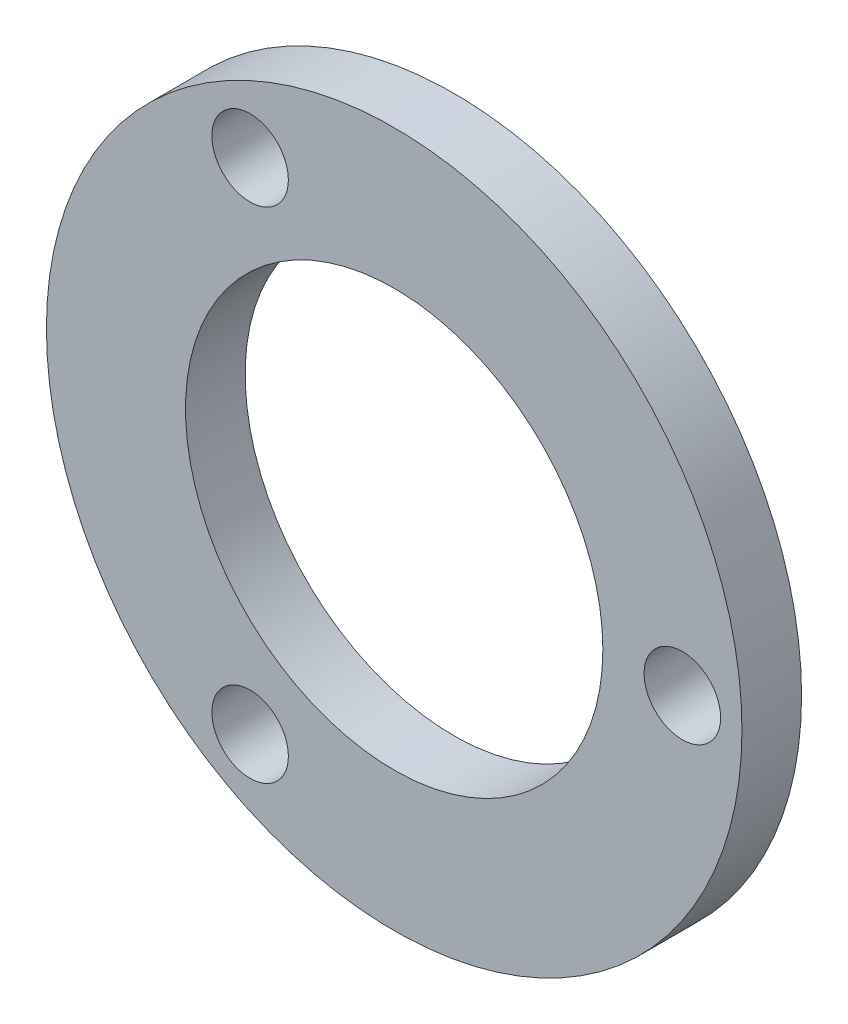
ISO-10303-21;
HEADER;
FILE_DESCRIPTION(('STEP AP214'),'2;1');
FILE_NAME('part.step','',(''),(''),'','','');
FILE_SCHEMA(('AUTOMOTIVE_DESIGN { 1 0 10303 214 1 1 1 1 }'));
ENDSEC;
DATA;
#1=APPLICATION_CONTEXT('core data for automotive mechanical design processes');
#2=APPLICATION_PROTOCOL_DEFINITION('international standard','automotive_design',2000,#1);
#3=PRODUCT_CONTEXT('',#1,'mechanical');
#4=PRODUCT('Part','Part','',(#3));
#5=PRODUCT_RELATED_PRODUCT_CATEGORY('part','',(#4));
#6=PRODUCT_DEFINITION_FORMATION('','',#4);
#7=PRODUCT_DEFINITION_CONTEXT('part definition',#1,'design');
#8=PRODUCT_DEFINITION('design','',#6,#7);
#9=PRODUCT_DEFINITION_SHAPE('','',#8);
#10=(LENGTH_UNIT() NAMED_UNIT(*) SI_UNIT(.MILLI.,.METRE.));
#11=(NAMED_UNIT(*) PLANE_ANGLE_UNIT() SI_UNIT($,.RADIAN.));
#12=(NAMED_UNIT(*) SI_UNIT($,.STERADIAN.) SOLID_ANGLE_UNIT());
#13=UNCERTAINTY_MEASURE_WITH_UNIT(LENGTH_MEASURE(1.E-05),#10,'distance_accuracy_value','');
#14=(GEOMETRIC_REPRESENTATION_CONTEXT(3) GLOBAL_UNCERTAINTY_ASSIGNED_CONTEXT((#13)) GLOBAL_UNIT_ASSIGNED_CONTEXT((#10,
#11,#12)) REPRESENTATION_CONTEXT('',''));
#15=CARTESIAN_POINT('',(0.,0.,0.));
#16=DIRECTION('',(0.,0.,1.));
#17=DIRECTION('',(1.,0.,0.));
#18=AXIS2_PLACEMENT_3D('',#15,#16,#17);
#19=CARTESIAN_POINT('',(0.000221945573697369,0.,3.));
#20=DIRECTION('',(0.,0.,1.));
#21=DIRECTION('',(1.,0.,0.));
#22=AXIS2_PLACEMENT_3D('',#19,#20,#21);
#23=PLANE('',#22);
#24=CARTESIAN_POINT('',(0.000221945573697369,0.,3.));
#25=DIRECTION('',(0.,0.,1.));
#26=DIRECTION('',(1.,0.,0.));
#27=AXIS2_PLACEMENT_3D('',#24,#25,#26);
#28=CIRCLE('',#27,10.5);
#29=CARTESIAN_POINT('',(10.5002219455737,0.,3.));
#30=VERTEX_POINT('',#29);
#31=EDGE_CURVE('E52',#30,#30,#28,.T.);
#32=ORIENTED_EDGE('',*,*,#31,.F.);
#33=EDGE_LOOP('',(#32));
#34=FACE_BOUND('',#33,.T.);
#35=CARTESIAN_POINT('',(-7.25011097278691,-12.5575605653794,3.));
#36=DIRECTION('',(0.,0.,1.));
#37=DIRECTION('',(1.,0.,0.));
#38=AXIS2_PLACEMENT_3D('',#35,#36,#37);
#39=CIRCLE('',#38,1.925);
#40=CARTESIAN_POINT('',(-5.3251109727869,-12.5575605653794,3.));
#41=VERTEX_POINT('',#40);
#42=EDGE_CURVE('E41',#41,#41,#39,.T.);
#43=ORIENTED_EDGE('',*,*,#42,.F.);
#44=EDGE_LOOP('',(#43));
#45=FACE_BOUND('',#44,.T.);
#46=CARTESIAN_POINT('',(0.000221945573697369,0.,3.));
#47=DIRECTION('',(0.,0.,1.));
#48=DIRECTION('',(1.,0.,0.));
#49=AXIS2_PLACEMENT_3D('',#46,#47,#48);
#50=CIRCLE('',#49,17.5);
#51=CARTESIAN_POINT('',(17.5002219455737,0.,3.));
#52=VERTEX_POINT('',#51);
#53=EDGE_CURVE('E10',#52,#52,#50,.T.);
#54=ORIENTED_EDGE('',*,*,#53,.T.);
#55=EDGE_LOOP('',(#54));
#56=FACE_BOUND('',#55,.T.);
#57=CARTESIAN_POINT('',(-7.25011097278673,12.5575605653795,3.));
#58=DIRECTION('',(0.,0.,1.));
#59=DIRECTION('',(1.,0.,0.));
#60=AXIS2_PLACEMENT_3D('',#57,#58,#59);
#61=CIRCLE('',#60,1.925);
#62=CARTESIAN_POINT('',(-5.32511097278673,12.5575605653795,3.));
#63=VERTEX_POINT('',#62);
#64=EDGE_CURVE('E46',#63,#63,#61,.T.);
#65=ORIENTED_EDGE('',*,*,#64,.F.);
#66=EDGE_LOOP('',(#65));
#67=FACE_BOUND('',#66,.T.);
#68=CARTESIAN_POINT('',(14.5002219455737,0.,3.));
#69=DIRECTION('',(0.,0.,1.));
#70=DIRECTION('',(1.,0.,0.));
#71=AXIS2_PLACEMENT_3D('',#68,#69,#70);
#72=CIRCLE('',#71,1.925);
#73=CARTESIAN_POINT('',(16.4252219455737,0.,3.));
#74=VERTEX_POINT('',#73);
#75=EDGE_CURVE('E58',#74,#74,#72,.T.);
#76=ORIENTED_EDGE('',*,*,#75,.F.);
#77=EDGE_LOOP('',(#76));
#78=FACE_BOUND('',#77,.T.);
#79=ADVANCED_FACE('F30',(#34,#45,#56,#67,#78),#23,.T.);
#80=CARTESIAN_POINT('',(0.000221945573697369,0.,0.));
#81=DIRECTION('',(0.,0.,1.));
#82=DIRECTION('',(1.,0.,0.));
#83=AXIS2_PLACEMENT_3D('',#80,#81,#82);
#84=PLANE('',#83);
#85=CARTESIAN_POINT('',(0.000221945573697369,0.,0.));
#86=DIRECTION('',(0.,0.,1.));
#87=DIRECTION('',(1.,0.,0.));
#88=AXIS2_PLACEMENT_3D('',#85,#86,#87);
#89=CIRCLE('',#88,17.5);
#90=CARTESIAN_POINT('',(17.5002219455737,0.,0.));
#91=VERTEX_POINT('',#90);
#92=EDGE_CURVE('E34',#91,#91,#89,.T.);
#93=ORIENTED_EDGE('',*,*,#92,.F.);
#94=EDGE_LOOP('',(#93));
#95=FACE_BOUND('',#94,.T.);
#96=CARTESIAN_POINT('',(-7.25011097278691,-12.5575605653794,0.));
#97=DIRECTION('',(0.,0.,1.));
#98=DIRECTION('',(1.,0.,0.));
#99=AXIS2_PLACEMENT_3D('',#96,#97,#98);
#100=CIRCLE('',#99,1.925);
#101=CARTESIAN_POINT('',(-5.3251109727869,-12.5575605653794,0.));
#102=VERTEX_POINT('',#101);
#103=EDGE_CURVE('E43',#102,#102,#100,.T.);
#104=ORIENTED_EDGE('',*,*,#103,.T.);
#105=EDGE_LOOP('',(#104));
#106=FACE_BOUND('',#105,.T.);
#107=CARTESIAN_POINT('',(-7.25011097278673,12.5575605653795,0.));
#108=DIRECTION('',(0.,0.,1.));
#109=DIRECTION('',(1.,0.,0.));
#110=AXIS2_PLACEMENT_3D('',#107,#108,#109);
#111=CIRCLE('',#110,1.925);
#112=CARTESIAN_POINT('',(-5.32511097278673,12.5575605653795,0.));
#113=VERTEX_POINT('',#112);
#114=EDGE_CURVE('E49',#113,#113,#111,.T.);
#115=ORIENTED_EDGE('',*,*,#114,.T.);
#116=EDGE_LOOP('',(#115));
#117=FACE_BOUND('',#116,.T.);
#118=CARTESIAN_POINT('',(0.000221945573697369,0.,0.));
#119=DIRECTION('',(0.,0.,1.));
#120=DIRECTION('',(1.,0.,0.));
#121=AXIS2_PLACEMENT_3D('',#118,#119,#120);
#122=CIRCLE('',#121,10.5);
#123=CARTESIAN_POINT('',(10.5002219455737,0.,0.));
#124=VERTEX_POINT('',#123);
#125=EDGE_CURVE('E55',#124,#124,#122,.T.);
#126=ORIENTED_EDGE('',*,*,#125,.T.);
#127=EDGE_LOOP('',(#126));
#128=FACE_BOUND('',#127,.T.);
#129=CARTESIAN_POINT('',(14.5002219455737,0.,0.));
#130=DIRECTION('',(0.,0.,1.));
#131=DIRECTION('',(1.,0.,0.));
#132=AXIS2_PLACEMENT_3D('',#129,#130,#131);
#133=CIRCLE('',#132,1.925);
#134=CARTESIAN_POINT('',(16.4252219455737,0.,0.));
#135=VERTEX_POINT('',#134);
#136=EDGE_CURVE('E61',#135,#135,#133,.T.);
#137=ORIENTED_EDGE('',*,*,#136,.T.);
#138=EDGE_LOOP('',(#137));
#139=FACE_BOUND('',#138,.T.);
#140=ADVANCED_FACE('F71',(#95,#106,#117,#128,#139),#84,.F.);
#141=CARTESIAN_POINT('',(0.000221945573697369,0.,3.));
#142=DIRECTION('',(0.,0.,-1.));
#143=DIRECTION('',(-1.,0.,0.));
#144=AXIS2_PLACEMENT_3D('',#141,#142,#143);
#145=CYLINDRICAL_SURFACE('',#144,17.5);
#146=ORIENTED_EDGE('',*,*,#53,.F.);
#147=EDGE_LOOP('',(#146));
#148=FACE_BOUND('',#147,.T.);
#149=ORIENTED_EDGE('',*,*,#92,.T.);
#150=EDGE_LOOP('',(#149));
#151=FACE_BOUND('',#150,.T.);
#152=ADVANCED_FACE('F32',(#148,#151),#145,.T.);
#153=CARTESIAN_POINT('',(-7.25011097278691,-12.5575605653794,3.));
#154=DIRECTION('',(0.,0.,-1.));
#155=DIRECTION('',(-1.,0.,0.));
#156=AXIS2_PLACEMENT_3D('',#153,#154,#155);
#157=CYLINDRICAL_SURFACE('',#156,1.925);
#158=ORIENTED_EDGE('',*,*,#42,.T.);
#159=EDGE_LOOP('',(#158));
#160=FACE_BOUND('',#159,.T.);
#161=ORIENTED_EDGE('',*,*,#103,.F.);
#162=EDGE_LOOP('',(#161));
#163=FACE_BOUND('',#162,.T.);
#164=ADVANCED_FACE('F81',(#160,#163),#157,.F.);
#165=CARTESIAN_POINT('',(-7.25011097278673,12.5575605653795,3.));
#166=DIRECTION('',(0.,0.,-1.));
#167=DIRECTION('',(-1.,0.,0.));
#168=AXIS2_PLACEMENT_3D('',#165,#166,#167);
#169=CYLINDRICAL_SURFACE('',#168,1.925);
#170=ORIENTED_EDGE('',*,*,#64,.T.);
#171=EDGE_LOOP('',(#170));
#172=FACE_BOUND('',#171,.T.);
#173=ORIENTED_EDGE('',*,*,#114,.F.);
#174=EDGE_LOOP('',(#173));
#175=FACE_BOUND('',#174,.T.);
#176=ADVANCED_FACE('F84',(#172,#175),#169,.F.);
#177=CARTESIAN_POINT('',(0.000221945573697369,0.,3.));
#178=DIRECTION('',(0.,0.,-1.));
#179=DIRECTION('',(-1.,0.,0.));
#180=AXIS2_PLACEMENT_3D('',#177,#178,#179);
#181=CYLINDRICAL_SURFACE('',#180,10.5);
#182=ORIENTED_EDGE('',*,*,#31,.T.);
#183=EDGE_LOOP('',(#182));
#184=FACE_BOUND('',#183,.T.);
#185=ORIENTED_EDGE('',*,*,#125,.F.);
#186=EDGE_LOOP('',(#185));
#187=FACE_BOUND('',#186,.T.);
#188=ADVANCED_FACE('F88',(#184,#187),#181,.F.);
#189=CARTESIAN_POINT('',(14.5002219455737,0.,3.));
#190=DIRECTION('',(0.,0.,-1.));
#191=DIRECTION('',(-1.,0.,0.));
#192=AXIS2_PLACEMENT_3D('',#189,#190,#191);
#193=CYLINDRICAL_SURFACE('',#192,1.925);
#194=ORIENTED_EDGE('',*,*,#75,.T.);
#195=EDGE_LOOP('',(#194));
#196=FACE_BOUND('',#195,.T.);
#197=ORIENTED_EDGE('',*,*,#136,.F.);
#198=EDGE_LOOP('',(#197));
#199=FACE_BOUND('',#198,.T.);
#200=ADVANCED_FACE('F67',(#196,#199),#193,.F.);
#201=CLOSED_SHELL('',(#79,#140,#152,#164,#176,#188,#200));
#202=MANIFOLD_SOLID_BREP('B2',#201);
#203=ADVANCED_BREP_SHAPE_REPRESENTATION('',(#18,#202),#14);
#204=SHAPE_DEFINITION_REPRESENTATION(#9,#203);
ENDSEC;
END-ISO-10303-21;
